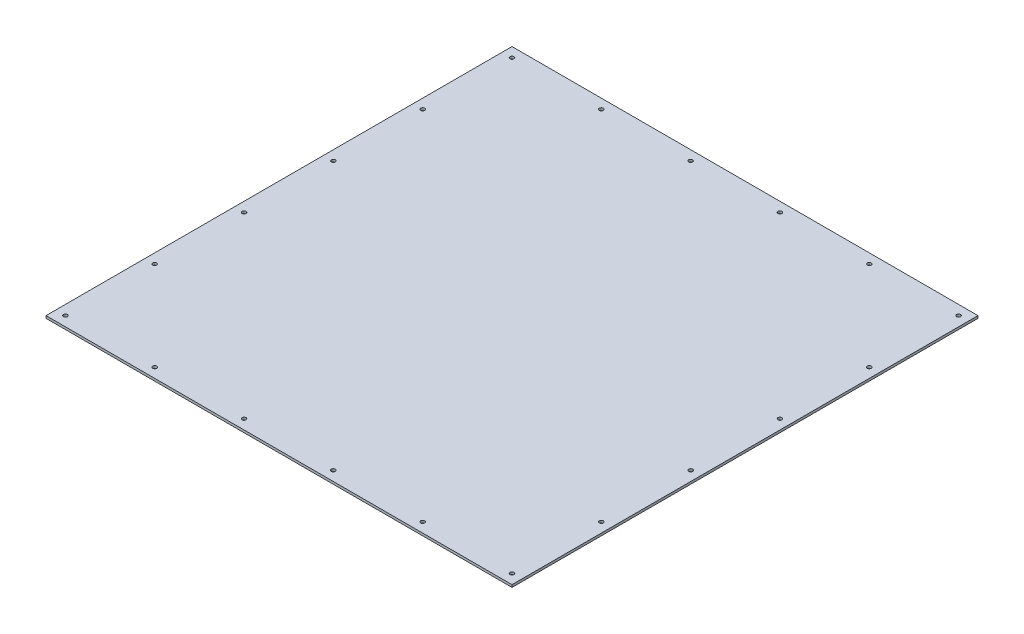
ISO-10303-21;
HEADER;
FILE_DESCRIPTION(('STEP AP214'),'2;1');
FILE_NAME('part.step','',(''),(''),'','','');
FILE_SCHEMA(('AUTOMOTIVE_DESIGN { 1 0 10303 214 1 1 1 1 }'));
ENDSEC;
DATA;
#1=APPLICATION_CONTEXT('core data for automotive mechanical design processes');
#2=APPLICATION_PROTOCOL_DEFINITION('international standard','automotive_design',2000,#1);
#3=PRODUCT_CONTEXT('',#1,'mechanical');
#4=PRODUCT('Part','Part','',(#3));
#5=PRODUCT_RELATED_PRODUCT_CATEGORY('part','',(#4));
#6=PRODUCT_DEFINITION_FORMATION('','',#4);
#7=PRODUCT_DEFINITION_CONTEXT('part definition',#1,'design');
#8=PRODUCT_DEFINITION('design','',#6,#7);
#9=PRODUCT_DEFINITION_SHAPE('','',#8);
#10=(LENGTH_UNIT() NAMED_UNIT(*) SI_UNIT(.MILLI.,.METRE.));
#11=(NAMED_UNIT(*) PLANE_ANGLE_UNIT() SI_UNIT($,.RADIAN.));
#12=(NAMED_UNIT(*) SI_UNIT($,.STERADIAN.) SOLID_ANGLE_UNIT());
#13=UNCERTAINTY_MEASURE_WITH_UNIT(LENGTH_MEASURE(1.E-05),#10,'distance_accuracy_value','');
#14=(GEOMETRIC_REPRESENTATION_CONTEXT(3) GLOBAL_UNCERTAINTY_ASSIGNED_CONTEXT((#13)) GLOBAL_UNIT_ASSIGNED_CONTEXT((#10,
#11,#12)) REPRESENTATION_CONTEXT('',''));
#15=CARTESIAN_POINT('',(0.,0.,0.));
#16=DIRECTION('',(0.,0.,1.));
#17=DIRECTION('',(1.,0.,0.));
#18=AXIS2_PLACEMENT_3D('',#15,#16,#17);
#19=CARTESIAN_POINT('',(0.,0.,0.));
#20=DIRECTION('',(0.,-1.,0.));
#21=DIRECTION('',(0.,0.,-1.));
#22=AXIS2_PLACEMENT_3D('',#19,#20,#21);
#23=PLANE('',#22);
#24=CARTESIAN_POINT('',(-292.1,0.,-292.1));
#25=DIRECTION('',(0.,1.,0.));
#26=DIRECTION('',(0.,0.,1.));
#27=AXIS2_PLACEMENT_3D('',#24,#25,#26);
#28=CIRCLE('',#27,2.5908);
#29=CARTESIAN_POINT('',(-292.1,0.,-289.5092));
#30=VERTEX_POINT('',#29);
#31=EDGE_CURVE('E284',#30,#30,#28,.T.);
#32=ORIENTED_EDGE('',*,*,#31,.T.);
#33=EDGE_LOOP('',(#32));
#34=FACE_BOUND('',#33,.T.);
#35=CARTESIAN_POINT('',(-175.26,0.,-292.1));
#36=DIRECTION('',(0.,1.,0.));
#37=DIRECTION('',(0.,0.,1.));
#38=AXIS2_PLACEMENT_3D('',#35,#36,#37);
#39=CIRCLE('',#38,2.5908);
#40=CARTESIAN_POINT('',(-175.26,0.,-289.5092));
#41=VERTEX_POINT('',#40);
#42=EDGE_CURVE('E276',#41,#41,#39,.T.);
#43=ORIENTED_EDGE('',*,*,#42,.T.);
#44=EDGE_LOOP('',(#43));
#45=FACE_BOUND('',#44,.T.);
#46=CARTESIAN_POINT('',(-58.42,0.,-292.1));
#47=DIRECTION('',(0.,1.,0.));
#48=DIRECTION('',(0.,0.,1.));
#49=AXIS2_PLACEMENT_3D('',#46,#47,#48);
#50=CIRCLE('',#49,2.5908);
#51=CARTESIAN_POINT('',(-58.42,0.,-289.5092));
#52=VERTEX_POINT('',#51);
#53=EDGE_CURVE('E268',#52,#52,#50,.T.);
#54=ORIENTED_EDGE('',*,*,#53,.T.);
#55=EDGE_LOOP('',(#54));
#56=FACE_BOUND('',#55,.T.);
#57=CARTESIAN_POINT('',(58.42,0.,-292.1));
#58=DIRECTION('',(0.,1.,0.));
#59=DIRECTION('',(0.,0.,1.));
#60=AXIS2_PLACEMENT_3D('',#57,#58,#59);
#61=CIRCLE('',#60,2.5908);
#62=CARTESIAN_POINT('',(58.42,0.,-289.5092));
#63=VERTEX_POINT('',#62);
#64=EDGE_CURVE('E260',#63,#63,#61,.T.);
#65=ORIENTED_EDGE('',*,*,#64,.T.);
#66=EDGE_LOOP('',(#65));
#67=FACE_BOUND('',#66,.T.);
#68=CARTESIAN_POINT('',(175.26,0.,-292.1));
#69=DIRECTION('',(0.,1.,0.));
#70=DIRECTION('',(0.,0.,1.));
#71=AXIS2_PLACEMENT_3D('',#68,#69,#70);
#72=CIRCLE('',#71,2.5908);
#73=CARTESIAN_POINT('',(175.26,0.,-289.5092));
#74=VERTEX_POINT('',#73);
#75=EDGE_CURVE('E252',#74,#74,#72,.T.);
#76=ORIENTED_EDGE('',*,*,#75,.T.);
#77=EDGE_LOOP('',(#76));
#78=FACE_BOUND('',#77,.T.);
#79=DIRECTION('',(0.,0.,-1.));
#80=VECTOR('',#79,1.);
#81=CARTESIAN_POINT('',(304.8,0.,304.8));
#82=LINE('',#81,#80);
#83=CARTESIAN_POINT('',(304.8,0.,304.8));
#84=VERTEX_POINT('',#83);
#85=CARTESIAN_POINT('',(304.8,0.,-304.8));
#86=VERTEX_POINT('',#85);
#87=EDGE_CURVE('E112',#84,#86,#82,.T.);
#88=ORIENTED_EDGE('',*,*,#87,.F.);
#89=DIRECTION('',(1.,0.,0.));
#90=VECTOR('',#89,1.);
#91=CARTESIAN_POINT('',(-304.8,0.,304.8));
#92=LINE('',#91,#90);
#93=CARTESIAN_POINT('',(-304.8,0.,304.8));
#94=VERTEX_POINT('',#93);
#95=EDGE_CURVE('E84',#94,#84,#92,.T.);
#96=ORIENTED_EDGE('',*,*,#95,.F.);
#97=DIRECTION('',(0.,0.,1.));
#98=VECTOR('',#97,1.);
#99=CARTESIAN_POINT('',(-304.8,0.,304.8));
#100=LINE('',#99,#98);
#101=CARTESIAN_POINT('',(-304.8,0.,-304.8));
#102=VERTEX_POINT('',#101);
#103=EDGE_CURVE('E78',#102,#94,#100,.T.);
#104=ORIENTED_EDGE('',*,*,#103,.F.);
#105=DIRECTION('',(-1.,0.,0.));
#106=VECTOR('',#105,1.);
#107=CARTESIAN_POINT('',(-304.8,0.,-304.8));
#108=LINE('',#107,#106);
#109=EDGE_CURVE('E101',#86,#102,#108,.T.);
#110=ORIENTED_EDGE('',*,*,#109,.F.);
#111=EDGE_LOOP('',(#88,#96,#104,#110));
#112=FACE_BOUND('',#111,.T.);
#113=CARTESIAN_POINT('',(292.1,0.,-292.1));
#114=DIRECTION('',(0.,1.,0.));
#115=DIRECTION('',(0.,0.,1.));
#116=AXIS2_PLACEMENT_3D('',#113,#114,#115);
#117=CIRCLE('',#116,2.5908);
#118=CARTESIAN_POINT('',(292.1,0.,-289.5092));
#119=VERTEX_POINT('',#118);
#120=EDGE_CURVE('E116',#119,#119,#117,.T.);
#121=ORIENTED_EDGE('',*,*,#120,.T.);
#122=EDGE_LOOP('',(#121));
#123=FACE_BOUND('',#122,.T.);
#124=CARTESIAN_POINT('',(292.1,0.,-175.26));
#125=DIRECTION('',(0.,1.,0.));
#126=DIRECTION('',(0.,0.,1.));
#127=AXIS2_PLACEMENT_3D('',#124,#125,#126);
#128=CIRCLE('',#127,2.5908);
#129=CARTESIAN_POINT('',(292.1,0.,-172.6692));
#130=VERTEX_POINT('',#129);
#131=EDGE_CURVE('E140',#130,#130,#128,.T.);
#132=ORIENTED_EDGE('',*,*,#131,.T.);
#133=EDGE_LOOP('',(#132));
#134=FACE_BOUND('',#133,.T.);
#135=CARTESIAN_POINT('',(292.1,0.,-58.42));
#136=DIRECTION('',(0.,1.,0.));
#137=DIRECTION('',(0.,0.,1.));
#138=AXIS2_PLACEMENT_3D('',#135,#136,#137);
#139=CIRCLE('',#138,2.5908);
#140=CARTESIAN_POINT('',(292.1,0.,-55.8292));
#141=VERTEX_POINT('',#140);
#142=EDGE_CURVE('E148',#141,#141,#139,.T.);
#143=ORIENTED_EDGE('',*,*,#142,.T.);
#144=EDGE_LOOP('',(#143));
#145=FACE_BOUND('',#144,.T.);
#146=CARTESIAN_POINT('',(292.1,0.,58.42));
#147=DIRECTION('',(0.,1.,0.));
#148=DIRECTION('',(0.,0.,1.));
#149=AXIS2_PLACEMENT_3D('',#146,#147,#148);
#150=CIRCLE('',#149,2.5908);
#151=CARTESIAN_POINT('',(292.1,0.,61.0108));
#152=VERTEX_POINT('',#151);
#153=EDGE_CURVE('E156',#152,#152,#150,.T.);
#154=ORIENTED_EDGE('',*,*,#153,.T.);
#155=EDGE_LOOP('',(#154));
#156=FACE_BOUND('',#155,.T.);
#157=CARTESIAN_POINT('',(292.1,0.,175.26));
#158=DIRECTION('',(0.,1.,0.));
#159=DIRECTION('',(0.,0.,1.));
#160=AXIS2_PLACEMENT_3D('',#157,#158,#159);
#161=CIRCLE('',#160,2.5908);
#162=CARTESIAN_POINT('',(292.1,0.,177.8508));
#163=VERTEX_POINT('',#162);
#164=EDGE_CURVE('E164',#163,#163,#161,.T.);
#165=ORIENTED_EDGE('',*,*,#164,.T.);
#166=EDGE_LOOP('',(#165));
#167=FACE_BOUND('',#166,.T.);
#168=CARTESIAN_POINT('',(292.1,0.,292.1));
#169=DIRECTION('',(0.,1.,0.));
#170=DIRECTION('',(0.,0.,1.));
#171=AXIS2_PLACEMENT_3D('',#168,#169,#170);
#172=CIRCLE('',#171,2.5908);
#173=CARTESIAN_POINT('',(292.1,0.,294.6908));
#174=VERTEX_POINT('',#173);
#175=EDGE_CURVE('E172',#174,#174,#172,.T.);
#176=ORIENTED_EDGE('',*,*,#175,.T.);
#177=EDGE_LOOP('',(#176));
#178=FACE_BOUND('',#177,.T.);
#179=CARTESIAN_POINT('',(-292.1,0.,292.1));
#180=DIRECTION('',(0.,1.,0.));
#181=DIRECTION('',(0.,0.,1.));
#182=AXIS2_PLACEMENT_3D('',#179,#180,#181);
#183=CIRCLE('',#182,2.5908);
#184=CARTESIAN_POINT('',(-292.1,0.,294.6908));
#185=VERTEX_POINT('',#184);
#186=EDGE_CURVE('E180',#185,#185,#183,.T.);
#187=ORIENTED_EDGE('',*,*,#186,.T.);
#188=EDGE_LOOP('',(#187));
#189=FACE_BOUND('',#188,.T.);
#190=CARTESIAN_POINT('',(-175.26,0.,292.1));
#191=DIRECTION('',(0.,1.,0.));
#192=DIRECTION('',(0.,0.,1.));
#193=AXIS2_PLACEMENT_3D('',#190,#191,#192);
#194=CIRCLE('',#193,2.5908);
#195=CARTESIAN_POINT('',(-175.26,0.,294.6908));
#196=VERTEX_POINT('',#195);
#197=EDGE_CURVE('E188',#196,#196,#194,.T.);
#198=ORIENTED_EDGE('',*,*,#197,.T.);
#199=EDGE_LOOP('',(#198));
#200=FACE_BOUND('',#199,.T.);
#201=CARTESIAN_POINT('',(-58.42,0.,292.1));
#202=DIRECTION('',(0.,1.,0.));
#203=DIRECTION('',(0.,0.,1.));
#204=AXIS2_PLACEMENT_3D('',#201,#202,#203);
#205=CIRCLE('',#204,2.5908);
#206=CARTESIAN_POINT('',(-58.42,0.,294.6908));
#207=VERTEX_POINT('',#206);
#208=EDGE_CURVE('E196',#207,#207,#205,.T.);
#209=ORIENTED_EDGE('',*,*,#208,.T.);
#210=EDGE_LOOP('',(#209));
#211=FACE_BOUND('',#210,.T.);
#212=CARTESIAN_POINT('',(58.42,0.,292.1));
#213=DIRECTION('',(0.,1.,0.));
#214=DIRECTION('',(0.,0.,1.));
#215=AXIS2_PLACEMENT_3D('',#212,#213,#214);
#216=CIRCLE('',#215,2.5908);
#217=CARTESIAN_POINT('',(58.42,0.,294.6908));
#218=VERTEX_POINT('',#217);
#219=EDGE_CURVE('E204',#218,#218,#216,.T.);
#220=ORIENTED_EDGE('',*,*,#219,.T.);
#221=EDGE_LOOP('',(#220));
#222=FACE_BOUND('',#221,.T.);
#223=CARTESIAN_POINT('',(175.26,0.,292.1));
#224=DIRECTION('',(0.,1.,0.));
#225=DIRECTION('',(0.,0.,1.));
#226=AXIS2_PLACEMENT_3D('',#223,#224,#225);
#227=CIRCLE('',#226,2.5908);
#228=CARTESIAN_POINT('',(175.26,0.,294.6908));
#229=VERTEX_POINT('',#228);
#230=EDGE_CURVE('E212',#229,#229,#227,.T.);
#231=ORIENTED_EDGE('',*,*,#230,.T.);
#232=EDGE_LOOP('',(#231));
#233=FACE_BOUND('',#232,.T.);
#234=CARTESIAN_POINT('',(-292.1,0.,175.26));
#235=DIRECTION('',(0.,1.,0.));
#236=DIRECTION('',(0.,0.,1.));
#237=AXIS2_PLACEMENT_3D('',#234,#235,#236);
#238=CIRCLE('',#237,2.5908);
#239=CARTESIAN_POINT('',(-292.1,0.,177.8508));
#240=VERTEX_POINT('',#239);
#241=EDGE_CURVE('E220',#240,#240,#238,.T.);
#242=ORIENTED_EDGE('',*,*,#241,.T.);
#243=EDGE_LOOP('',(#242));
#244=FACE_BOUND('',#243,.T.);
#245=CARTESIAN_POINT('',(-292.1,0.,58.42));
#246=DIRECTION('',(0.,1.,0.));
#247=DIRECTION('',(0.,0.,1.));
#248=AXIS2_PLACEMENT_3D('',#245,#246,#247);
#249=CIRCLE('',#248,2.5908);
#250=CARTESIAN_POINT('',(-292.1,0.,61.0108));
#251=VERTEX_POINT('',#250);
#252=EDGE_CURVE('E228',#251,#251,#249,.T.);
#253=ORIENTED_EDGE('',*,*,#252,.T.);
#254=EDGE_LOOP('',(#253));
#255=FACE_BOUND('',#254,.T.);
#256=CARTESIAN_POINT('',(-292.1,0.,-58.42));
#257=DIRECTION('',(0.,1.,0.));
#258=DIRECTION('',(0.,0.,1.));
#259=AXIS2_PLACEMENT_3D('',#256,#257,#258);
#260=CIRCLE('',#259,2.5908);
#261=CARTESIAN_POINT('',(-292.1,0.,-55.8292));
#262=VERTEX_POINT('',#261);
#263=EDGE_CURVE('E236',#262,#262,#260,.T.);
#264=ORIENTED_EDGE('',*,*,#263,.T.);
#265=EDGE_LOOP('',(#264));
#266=FACE_BOUND('',#265,.T.);
#267=CARTESIAN_POINT('',(-292.1,0.,-175.26));
#268=DIRECTION('',(0.,1.,0.));
#269=DIRECTION('',(0.,0.,1.));
#270=AXIS2_PLACEMENT_3D('',#267,#268,#269);
#271=CIRCLE('',#270,2.5908);
#272=CARTESIAN_POINT('',(-292.1,0.,-172.6692));
#273=VERTEX_POINT('',#272);
#274=EDGE_CURVE('E244',#273,#273,#271,.T.);
#275=ORIENTED_EDGE('',*,*,#274,.T.);
#276=EDGE_LOOP('',(#275));
#277=FACE_BOUND('',#276,.T.);
#278=ADVANCED_FACE('F43',(#34,#45,#56,#67,#78,#112,#123,#134,#145,#156,#167,#178,#189,#200,#211,
#222,#233,#244,#255,#266,#277),#23,.T.);
#279=CARTESIAN_POINT('',(304.8,3.175,304.8));
#280=DIRECTION('',(-1.,0.,0.));
#281=DIRECTION('',(0.,0.,1.));
#282=AXIS2_PLACEMENT_3D('',#279,#280,#281);
#283=PLANE('',#282);
#284=ORIENTED_EDGE('',*,*,#87,.T.);
#285=DIRECTION('',(0.,-1.,0.));
#286=VECTOR('',#285,1.);
#287=CARTESIAN_POINT('',(304.8,3.175,-304.8));
#288=LINE('',#287,#286);
#289=CARTESIAN_POINT('',(304.8,3.175,-304.8));
#290=VERTEX_POINT('',#289);
#291=EDGE_CURVE('E11',#290,#86,#288,.T.);
#292=ORIENTED_EDGE('',*,*,#291,.F.);
#293=DIRECTION('',(0.,0.,-1.));
#294=VECTOR('',#293,1.);
#295=CARTESIAN_POINT('',(304.8,3.175,304.8));
#296=LINE('',#295,#294);
#297=CARTESIAN_POINT('',(304.8,3.175,304.8));
#298=VERTEX_POINT('',#297);
#299=EDGE_CURVE('E96',#298,#290,#296,.T.);
#300=ORIENTED_EDGE('',*,*,#299,.F.);
#301=DIRECTION('',(0.,-1.,0.));
#302=VECTOR('',#301,1.);
#303=CARTESIAN_POINT('',(304.8,3.175,304.8));
#304=LINE('',#303,#302);
#305=EDGE_CURVE('E108',#298,#84,#304,.T.);
#306=ORIENTED_EDGE('',*,*,#305,.T.);
#307=EDGE_LOOP('',(#284,#292,#300,#306));
#308=FACE_BOUND('',#307,.T.);
#309=ADVANCED_FACE('F45',(#308),#283,.F.);
#310=CARTESIAN_POINT('',(-304.8,3.175,-304.8));
#311=DIRECTION('',(0.,0.,1.));
#312=DIRECTION('',(1.,0.,0.));
#313=AXIS2_PLACEMENT_3D('',#310,#311,#312);
#314=PLANE('',#313);
#315=ORIENTED_EDGE('',*,*,#109,.T.);
#316=DIRECTION('',(0.,-1.,0.));
#317=VECTOR('',#316,1.);
#318=CARTESIAN_POINT('',(-304.8,3.175,-304.8));
#319=LINE('',#318,#317);
#320=CARTESIAN_POINT('',(-304.8,3.175,-304.8));
#321=VERTEX_POINT('',#320);
#322=EDGE_CURVE('E53',#321,#102,#319,.T.);
#323=ORIENTED_EDGE('',*,*,#322,.F.);
#324=DIRECTION('',(-1.,0.,0.));
#325=VECTOR('',#324,1.);
#326=CARTESIAN_POINT('',(-304.8,3.175,-304.8));
#327=LINE('',#326,#325);
#328=EDGE_CURVE('E91',#290,#321,#327,.T.);
#329=ORIENTED_EDGE('',*,*,#328,.F.);
#330=ORIENTED_EDGE('',*,*,#291,.T.);
#331=EDGE_LOOP('',(#315,#323,#329,#330));
#332=FACE_BOUND('',#331,.T.);
#333=ADVANCED_FACE('F100',(#332),#314,.F.);
#334=CARTESIAN_POINT('',(-304.8,3.175,304.8));
#335=DIRECTION('',(1.,0.,0.));
#336=DIRECTION('',(0.,0.,-1.));
#337=AXIS2_PLACEMENT_3D('',#334,#335,#336);
#338=PLANE('',#337);
#339=ORIENTED_EDGE('',*,*,#103,.T.);
#340=DIRECTION('',(0.,-1.,0.));
#341=VECTOR('',#340,1.);
#342=CARTESIAN_POINT('',(-304.8,3.175,304.8));
#343=LINE('',#342,#341);
#344=CARTESIAN_POINT('',(-304.8,3.175,304.8));
#345=VERTEX_POINT('',#344);
#346=EDGE_CURVE('E103',#345,#94,#343,.T.);
#347=ORIENTED_EDGE('',*,*,#346,.F.);
#348=DIRECTION('',(0.,0.,1.));
#349=VECTOR('',#348,1.);
#350=CARTESIAN_POINT('',(-304.8,3.175,304.8));
#351=LINE('',#350,#349);
#352=EDGE_CURVE('E94',#321,#345,#351,.T.);
#353=ORIENTED_EDGE('',*,*,#352,.F.);
#354=ORIENTED_EDGE('',*,*,#322,.T.);
#355=EDGE_LOOP('',(#339,#347,#353,#354));
#356=FACE_BOUND('',#355,.T.);
#357=ADVANCED_FACE('F104',(#356),#338,.F.);
#358=CARTESIAN_POINT('',(-304.8,3.175,304.8));
#359=DIRECTION('',(0.,0.,-1.));
#360=DIRECTION('',(-1.,0.,0.));
#361=AXIS2_PLACEMENT_3D('',#358,#359,#360);
#362=PLANE('',#361);
#363=ORIENTED_EDGE('',*,*,#95,.T.);
#364=ORIENTED_EDGE('',*,*,#305,.F.);
#365=DIRECTION('',(1.,0.,0.));
#366=VECTOR('',#365,1.);
#367=CARTESIAN_POINT('',(-304.8,3.175,304.8));
#368=LINE('',#367,#366);
#369=EDGE_CURVE('E61',#345,#298,#368,.T.);
#370=ORIENTED_EDGE('',*,*,#369,.F.);
#371=ORIENTED_EDGE('',*,*,#346,.T.);
#372=EDGE_LOOP('',(#363,#364,#370,#371));
#373=FACE_BOUND('',#372,.T.);
#374=ADVANCED_FACE('F126',(#373),#362,.F.);
#375=CARTESIAN_POINT('',(0.,3.175,0.));
#376=DIRECTION('',(0.,-1.,0.));
#377=DIRECTION('',(0.,0.,-1.));
#378=AXIS2_PLACEMENT_3D('',#375,#376,#377);
#379=PLANE('',#378);
#380=CARTESIAN_POINT('',(-292.1,3.175,-292.1));
#381=DIRECTION('',(0.,1.,0.));
#382=DIRECTION('',(0.,0.,1.));
#383=AXIS2_PLACEMENT_3D('',#380,#381,#382);
#384=CIRCLE('',#383,2.5908);
#385=CARTESIAN_POINT('',(-292.1,3.175,-289.5092));
#386=VERTEX_POINT('',#385);
#387=EDGE_CURVE('E288',#386,#386,#384,.T.);
#388=ORIENTED_EDGE('',*,*,#387,.F.);
#389=EDGE_LOOP('',(#388));
#390=FACE_BOUND('',#389,.T.);
#391=CARTESIAN_POINT('',(-175.26,3.175,-292.1));
#392=DIRECTION('',(0.,1.,0.));
#393=DIRECTION('',(0.,0.,1.));
#394=AXIS2_PLACEMENT_3D('',#391,#392,#393);
#395=CIRCLE('',#394,2.5908);
#396=CARTESIAN_POINT('',(-175.26,3.175,-289.5092));
#397=VERTEX_POINT('',#396);
#398=EDGE_CURVE('E280',#397,#397,#395,.T.);
#399=ORIENTED_EDGE('',*,*,#398,.F.);
#400=EDGE_LOOP('',(#399));
#401=FACE_BOUND('',#400,.T.);
#402=CARTESIAN_POINT('',(-58.42,3.175,-292.1));
#403=DIRECTION('',(0.,1.,0.));
#404=DIRECTION('',(0.,0.,1.));
#405=AXIS2_PLACEMENT_3D('',#402,#403,#404);
#406=CIRCLE('',#405,2.5908);
#407=CARTESIAN_POINT('',(-58.42,3.175,-289.5092));
#408=VERTEX_POINT('',#407);
#409=EDGE_CURVE('E272',#408,#408,#406,.T.);
#410=ORIENTED_EDGE('',*,*,#409,.F.);
#411=EDGE_LOOP('',(#410));
#412=FACE_BOUND('',#411,.T.);
#413=CARTESIAN_POINT('',(58.42,3.175,-292.1));
#414=DIRECTION('',(0.,1.,0.));
#415=DIRECTION('',(0.,0.,1.));
#416=AXIS2_PLACEMENT_3D('',#413,#414,#415);
#417=CIRCLE('',#416,2.5908);
#418=CARTESIAN_POINT('',(58.42,3.175,-289.5092));
#419=VERTEX_POINT('',#418);
#420=EDGE_CURVE('E264',#419,#419,#417,.T.);
#421=ORIENTED_EDGE('',*,*,#420,.F.);
#422=EDGE_LOOP('',(#421));
#423=FACE_BOUND('',#422,.T.);
#424=CARTESIAN_POINT('',(175.26,3.175,-292.1));
#425=DIRECTION('',(0.,1.,0.));
#426=DIRECTION('',(0.,0.,1.));
#427=AXIS2_PLACEMENT_3D('',#424,#425,#426);
#428=CIRCLE('',#427,2.5908);
#429=CARTESIAN_POINT('',(175.26,3.175,-289.5092));
#430=VERTEX_POINT('',#429);
#431=EDGE_CURVE('E256',#430,#430,#428,.T.);
#432=ORIENTED_EDGE('',*,*,#431,.F.);
#433=EDGE_LOOP('',(#432));
#434=FACE_BOUND('',#433,.T.);
#435=CARTESIAN_POINT('',(-292.1,3.175,-175.26));
#436=DIRECTION('',(0.,1.,0.));
#437=DIRECTION('',(0.,0.,1.));
#438=AXIS2_PLACEMENT_3D('',#435,#436,#437);
#439=CIRCLE('',#438,2.5908);
#440=CARTESIAN_POINT('',(-292.1,3.175,-172.6692));
#441=VERTEX_POINT('',#440);
#442=EDGE_CURVE('E248',#441,#441,#439,.T.);
#443=ORIENTED_EDGE('',*,*,#442,.F.);
#444=EDGE_LOOP('',(#443));
#445=FACE_BOUND('',#444,.T.);
#446=CARTESIAN_POINT('',(-292.1,3.175,-58.42));
#447=DIRECTION('',(0.,1.,0.));
#448=DIRECTION('',(0.,0.,1.));
#449=AXIS2_PLACEMENT_3D('',#446,#447,#448);
#450=CIRCLE('',#449,2.5908);
#451=CARTESIAN_POINT('',(-292.1,3.175,-55.8292));
#452=VERTEX_POINT('',#451);
#453=EDGE_CURVE('E240',#452,#452,#450,.T.);
#454=ORIENTED_EDGE('',*,*,#453,.F.);
#455=EDGE_LOOP('',(#454));
#456=FACE_BOUND('',#455,.T.);
#457=CARTESIAN_POINT('',(-292.1,3.175,58.42));
#458=DIRECTION('',(0.,1.,0.));
#459=DIRECTION('',(0.,0.,1.));
#460=AXIS2_PLACEMENT_3D('',#457,#458,#459);
#461=CIRCLE('',#460,2.5908);
#462=CARTESIAN_POINT('',(-292.1,3.175,61.0108));
#463=VERTEX_POINT('',#462);
#464=EDGE_CURVE('E232',#463,#463,#461,.T.);
#465=ORIENTED_EDGE('',*,*,#464,.F.);
#466=EDGE_LOOP('',(#465));
#467=FACE_BOUND('',#466,.T.);
#468=CARTESIAN_POINT('',(-292.1,3.175,175.26));
#469=DIRECTION('',(0.,1.,0.));
#470=DIRECTION('',(0.,0.,1.));
#471=AXIS2_PLACEMENT_3D('',#468,#469,#470);
#472=CIRCLE('',#471,2.5908);
#473=CARTESIAN_POINT('',(-292.1,3.175,177.8508));
#474=VERTEX_POINT('',#473);
#475=EDGE_CURVE('E224',#474,#474,#472,.T.);
#476=ORIENTED_EDGE('',*,*,#475,.F.);
#477=EDGE_LOOP('',(#476));
#478=FACE_BOUND('',#477,.T.);
#479=CARTESIAN_POINT('',(175.26,3.175,292.1));
#480=DIRECTION('',(0.,1.,0.));
#481=DIRECTION('',(0.,0.,1.));
#482=AXIS2_PLACEMENT_3D('',#479,#480,#481);
#483=CIRCLE('',#482,2.5908);
#484=CARTESIAN_POINT('',(175.26,3.175,294.6908));
#485=VERTEX_POINT('',#484);
#486=EDGE_CURVE('E216',#485,#485,#483,.T.);
#487=ORIENTED_EDGE('',*,*,#486,.F.);
#488=EDGE_LOOP('',(#487));
#489=FACE_BOUND('',#488,.T.);
#490=CARTESIAN_POINT('',(58.42,3.175,292.1));
#491=DIRECTION('',(0.,1.,0.));
#492=DIRECTION('',(0.,0.,1.));
#493=AXIS2_PLACEMENT_3D('',#490,#491,#492);
#494=CIRCLE('',#493,2.5908);
#495=CARTESIAN_POINT('',(58.42,3.175,294.6908));
#496=VERTEX_POINT('',#495);
#497=EDGE_CURVE('E208',#496,#496,#494,.T.);
#498=ORIENTED_EDGE('',*,*,#497,.F.);
#499=EDGE_LOOP('',(#498));
#500=FACE_BOUND('',#499,.T.);
#501=CARTESIAN_POINT('',(-58.42,3.175,292.1));
#502=DIRECTION('',(0.,1.,0.));
#503=DIRECTION('',(0.,0.,1.));
#504=AXIS2_PLACEMENT_3D('',#501,#502,#503);
#505=CIRCLE('',#504,2.5908);
#506=CARTESIAN_POINT('',(-58.42,3.175,294.6908));
#507=VERTEX_POINT('',#506);
#508=EDGE_CURVE('E200',#507,#507,#505,.T.);
#509=ORIENTED_EDGE('',*,*,#508,.F.);
#510=EDGE_LOOP('',(#509));
#511=FACE_BOUND('',#510,.T.);
#512=CARTESIAN_POINT('',(-175.26,3.175,292.1));
#513=DIRECTION('',(0.,1.,0.));
#514=DIRECTION('',(0.,0.,1.));
#515=AXIS2_PLACEMENT_3D('',#512,#513,#514);
#516=CIRCLE('',#515,2.5908);
#517=CARTESIAN_POINT('',(-175.26,3.175,294.6908));
#518=VERTEX_POINT('',#517);
#519=EDGE_CURVE('E192',#518,#518,#516,.T.);
#520=ORIENTED_EDGE('',*,*,#519,.F.);
#521=EDGE_LOOP('',(#520));
#522=FACE_BOUND('',#521,.T.);
#523=CARTESIAN_POINT('',(-292.1,3.175,292.1));
#524=DIRECTION('',(0.,1.,0.));
#525=DIRECTION('',(0.,0.,1.));
#526=AXIS2_PLACEMENT_3D('',#523,#524,#525);
#527=CIRCLE('',#526,2.5908);
#528=CARTESIAN_POINT('',(-292.1,3.175,294.6908));
#529=VERTEX_POINT('',#528);
#530=EDGE_CURVE('E184',#529,#529,#527,.T.);
#531=ORIENTED_EDGE('',*,*,#530,.F.);
#532=EDGE_LOOP('',(#531));
#533=FACE_BOUND('',#532,.T.);
#534=CARTESIAN_POINT('',(292.1,3.175,292.1));
#535=DIRECTION('',(0.,1.,0.));
#536=DIRECTION('',(0.,0.,1.));
#537=AXIS2_PLACEMENT_3D('',#534,#535,#536);
#538=CIRCLE('',#537,2.5908);
#539=CARTESIAN_POINT('',(292.1,3.175,294.6908));
#540=VERTEX_POINT('',#539);
#541=EDGE_CURVE('E176',#540,#540,#538,.T.);
#542=ORIENTED_EDGE('',*,*,#541,.F.);
#543=EDGE_LOOP('',(#542));
#544=FACE_BOUND('',#543,.T.);
#545=CARTESIAN_POINT('',(292.1,3.175,175.26));
#546=DIRECTION('',(0.,1.,0.));
#547=DIRECTION('',(0.,0.,1.));
#548=AXIS2_PLACEMENT_3D('',#545,#546,#547);
#549=CIRCLE('',#548,2.5908);
#550=CARTESIAN_POINT('',(292.1,3.175,177.8508));
#551=VERTEX_POINT('',#550);
#552=EDGE_CURVE('E168',#551,#551,#549,.T.);
#553=ORIENTED_EDGE('',*,*,#552,.F.);
#554=EDGE_LOOP('',(#553));
#555=FACE_BOUND('',#554,.T.);
#556=CARTESIAN_POINT('',(292.1,3.175,58.42));
#557=DIRECTION('',(0.,1.,0.));
#558=DIRECTION('',(0.,0.,1.));
#559=AXIS2_PLACEMENT_3D('',#556,#557,#558);
#560=CIRCLE('',#559,2.5908);
#561=CARTESIAN_POINT('',(292.1,3.175,61.0108));
#562=VERTEX_POINT('',#561);
#563=EDGE_CURVE('E160',#562,#562,#560,.T.);
#564=ORIENTED_EDGE('',*,*,#563,.F.);
#565=EDGE_LOOP('',(#564));
#566=FACE_BOUND('',#565,.T.);
#567=CARTESIAN_POINT('',(292.1,3.175,-58.42));
#568=DIRECTION('',(0.,1.,0.));
#569=DIRECTION('',(0.,0.,1.));
#570=AXIS2_PLACEMENT_3D('',#567,#568,#569);
#571=CIRCLE('',#570,2.5908);
#572=CARTESIAN_POINT('',(292.1,3.175,-55.8292));
#573=VERTEX_POINT('',#572);
#574=EDGE_CURVE('E152',#573,#573,#571,.T.);
#575=ORIENTED_EDGE('',*,*,#574,.F.);
#576=EDGE_LOOP('',(#575));
#577=FACE_BOUND('',#576,.T.);
#578=CARTESIAN_POINT('',(292.1,3.175,-175.26));
#579=DIRECTION('',(0.,1.,0.));
#580=DIRECTION('',(0.,0.,1.));
#581=AXIS2_PLACEMENT_3D('',#578,#579,#580);
#582=CIRCLE('',#581,2.5908);
#583=CARTESIAN_POINT('',(292.1,3.175,-172.6692));
#584=VERTEX_POINT('',#583);
#585=EDGE_CURVE('E144',#584,#584,#582,.T.);
#586=ORIENTED_EDGE('',*,*,#585,.F.);
#587=EDGE_LOOP('',(#586));
#588=FACE_BOUND('',#587,.T.);
#589=CARTESIAN_POINT('',(292.1,3.175,-292.1));
#590=DIRECTION('',(0.,1.,0.));
#591=DIRECTION('',(0.,0.,1.));
#592=AXIS2_PLACEMENT_3D('',#589,#590,#591);
#593=CIRCLE('',#592,2.5908);
#594=CARTESIAN_POINT('',(292.1,3.175,-289.5092));
#595=VERTEX_POINT('',#594);
#596=EDGE_CURVE('E136',#595,#595,#593,.T.);
#597=ORIENTED_EDGE('',*,*,#596,.F.);
#598=EDGE_LOOP('',(#597));
#599=FACE_BOUND('',#598,.T.);
#600=ORIENTED_EDGE('',*,*,#299,.T.);
#601=ORIENTED_EDGE('',*,*,#328,.T.);
#602=ORIENTED_EDGE('',*,*,#352,.T.);
#603=ORIENTED_EDGE('',*,*,#369,.T.);
#604=EDGE_LOOP('',(#600,#601,#602,#603));
#605=FACE_BOUND('',#604,.T.);
#606=ADVANCED_FACE('F92',(#390,#401,#412,#423,#434,#445,#456,#467,#478,#489,#500,#511,#522,#533,
#544,#555,#566,#577,#588,#599,#605),#379,.F.);
#607=CARTESIAN_POINT('',(292.1,3.175,-292.1));
#608=DIRECTION('',(0.,1.,0.));
#609=DIRECTION('',(0.,0.,1.));
#610=AXIS2_PLACEMENT_3D('',#607,#608,#609);
#611=CYLINDRICAL_SURFACE('',#610,2.5908);
#612=ORIENTED_EDGE('',*,*,#120,.F.);
#613=EDGE_LOOP('',(#612));
#614=FACE_BOUND('',#613,.T.);
#615=ORIENTED_EDGE('',*,*,#596,.T.);
#616=EDGE_LOOP('',(#615));
#617=FACE_BOUND('',#616,.T.);
#618=ADVANCED_FACE('F297',(#614,#617),#611,.F.);
#619=CARTESIAN_POINT('',(292.1,3.175,-175.26));
#620=DIRECTION('',(0.,1.,0.));
#621=DIRECTION('',(0.,0.,1.));
#622=AXIS2_PLACEMENT_3D('',#619,#620,#621);
#623=CYLINDRICAL_SURFACE('',#622,2.5908);
#624=ORIENTED_EDGE('',*,*,#131,.F.);
#625=EDGE_LOOP('',(#624));
#626=FACE_BOUND('',#625,.T.);
#627=ORIENTED_EDGE('',*,*,#585,.T.);
#628=EDGE_LOOP('',(#627));
#629=FACE_BOUND('',#628,.T.);
#630=ADVANCED_FACE('F338',(#626,#629),#623,.F.);
#631=CARTESIAN_POINT('',(292.1,3.175,-58.42));
#632=DIRECTION('',(0.,1.,0.));
#633=DIRECTION('',(0.,0.,1.));
#634=AXIS2_PLACEMENT_3D('',#631,#632,#633);
#635=CYLINDRICAL_SURFACE('',#634,2.5908);
#636=ORIENTED_EDGE('',*,*,#142,.F.);
#637=EDGE_LOOP('',(#636));
#638=FACE_BOUND('',#637,.T.);
#639=ORIENTED_EDGE('',*,*,#574,.T.);
#640=EDGE_LOOP('',(#639));
#641=FACE_BOUND('',#640,.T.);
#642=ADVANCED_FACE('F344',(#638,#641),#635,.F.);
#643=CARTESIAN_POINT('',(292.1,3.175,58.42));
#644=DIRECTION('',(0.,1.,0.));
#645=DIRECTION('',(0.,0.,1.));
#646=AXIS2_PLACEMENT_3D('',#643,#644,#645);
#647=CYLINDRICAL_SURFACE('',#646,2.5908);
#648=ORIENTED_EDGE('',*,*,#153,.F.);
#649=EDGE_LOOP('',(#648));
#650=FACE_BOUND('',#649,.T.);
#651=ORIENTED_EDGE('',*,*,#563,.T.);
#652=EDGE_LOOP('',(#651));
#653=FACE_BOUND('',#652,.T.);
#654=ADVANCED_FACE('F401',(#650,#653),#647,.F.);
#655=CARTESIAN_POINT('',(292.1,3.175,175.26));
#656=DIRECTION('',(0.,1.,0.));
#657=DIRECTION('',(0.,0.,1.));
#658=AXIS2_PLACEMENT_3D('',#655,#656,#657);
#659=CYLINDRICAL_SURFACE('',#658,2.5908);
#660=ORIENTED_EDGE('',*,*,#164,.F.);
#661=EDGE_LOOP('',(#660));
#662=FACE_BOUND('',#661,.T.);
#663=ORIENTED_EDGE('',*,*,#552,.T.);
#664=EDGE_LOOP('',(#663));
#665=FACE_BOUND('',#664,.T.);
#666=ADVANCED_FACE('F412',(#662,#665),#659,.F.);
#667=CARTESIAN_POINT('',(292.1,3.175,292.1));
#668=DIRECTION('',(0.,1.,0.));
#669=DIRECTION('',(0.,0.,1.));
#670=AXIS2_PLACEMENT_3D('',#667,#668,#669);
#671=CYLINDRICAL_SURFACE('',#670,2.5908);
#672=ORIENTED_EDGE('',*,*,#175,.F.);
#673=EDGE_LOOP('',(#672));
#674=FACE_BOUND('',#673,.T.);
#675=ORIENTED_EDGE('',*,*,#541,.T.);
#676=EDGE_LOOP('',(#675));
#677=FACE_BOUND('',#676,.T.);
#678=ADVANCED_FACE('F423',(#674,#677),#671,.F.);
#679=CARTESIAN_POINT('',(-292.1,3.175,292.1));
#680=DIRECTION('',(0.,1.,0.));
#681=DIRECTION('',(0.,0.,1.));
#682=AXIS2_PLACEMENT_3D('',#679,#680,#681);
#683=CYLINDRICAL_SURFACE('',#682,2.5908);
#684=ORIENTED_EDGE('',*,*,#186,.F.);
#685=EDGE_LOOP('',(#684));
#686=FACE_BOUND('',#685,.T.);
#687=ORIENTED_EDGE('',*,*,#530,.T.);
#688=EDGE_LOOP('',(#687));
#689=FACE_BOUND('',#688,.T.);
#690=ADVANCED_FACE('F434',(#686,#689),#683,.F.);
#691=CARTESIAN_POINT('',(-175.26,3.175,292.1));
#692=DIRECTION('',(0.,1.,0.));
#693=DIRECTION('',(0.,0.,1.));
#694=AXIS2_PLACEMENT_3D('',#691,#692,#693);
#695=CYLINDRICAL_SURFACE('',#694,2.5908);
#696=ORIENTED_EDGE('',*,*,#197,.F.);
#697=EDGE_LOOP('',(#696));
#698=FACE_BOUND('',#697,.T.);
#699=ORIENTED_EDGE('',*,*,#519,.T.);
#700=EDGE_LOOP('',(#699));
#701=FACE_BOUND('',#700,.T.);
#702=ADVANCED_FACE('F445',(#698,#701),#695,.F.);
#703=CARTESIAN_POINT('',(-58.42,3.175,292.1));
#704=DIRECTION('',(0.,1.,0.));
#705=DIRECTION('',(0.,0.,1.));
#706=AXIS2_PLACEMENT_3D('',#703,#704,#705);
#707=CYLINDRICAL_SURFACE('',#706,2.5908);
#708=ORIENTED_EDGE('',*,*,#208,.F.);
#709=EDGE_LOOP('',(#708));
#710=FACE_BOUND('',#709,.T.);
#711=ORIENTED_EDGE('',*,*,#508,.T.);
#712=EDGE_LOOP('',(#711));
#713=FACE_BOUND('',#712,.T.);
#714=ADVANCED_FACE('F456',(#710,#713),#707,.F.);
#715=CARTESIAN_POINT('',(58.42,3.175,292.1));
#716=DIRECTION('',(0.,1.,0.));
#717=DIRECTION('',(0.,0.,1.));
#718=AXIS2_PLACEMENT_3D('',#715,#716,#717);
#719=CYLINDRICAL_SURFACE('',#718,2.5908);
#720=ORIENTED_EDGE('',*,*,#219,.F.);
#721=EDGE_LOOP('',(#720));
#722=FACE_BOUND('',#721,.T.);
#723=ORIENTED_EDGE('',*,*,#497,.T.);
#724=EDGE_LOOP('',(#723));
#725=FACE_BOUND('',#724,.T.);
#726=ADVANCED_FACE('F467',(#722,#725),#719,.F.);
#727=CARTESIAN_POINT('',(175.26,3.175,292.1));
#728=DIRECTION('',(0.,1.,0.));
#729=DIRECTION('',(0.,0.,1.));
#730=AXIS2_PLACEMENT_3D('',#727,#728,#729);
#731=CYLINDRICAL_SURFACE('',#730,2.5908);
#732=ORIENTED_EDGE('',*,*,#230,.F.);
#733=EDGE_LOOP('',(#732));
#734=FACE_BOUND('',#733,.T.);
#735=ORIENTED_EDGE('',*,*,#486,.T.);
#736=EDGE_LOOP('',(#735));
#737=FACE_BOUND('',#736,.T.);
#738=ADVANCED_FACE('F478',(#734,#737),#731,.F.);
#739=CARTESIAN_POINT('',(-292.1,3.175,175.26));
#740=DIRECTION('',(0.,1.,0.));
#741=DIRECTION('',(0.,0.,1.));
#742=AXIS2_PLACEMENT_3D('',#739,#740,#741);
#743=CYLINDRICAL_SURFACE('',#742,2.5908);
#744=ORIENTED_EDGE('',*,*,#241,.F.);
#745=EDGE_LOOP('',(#744));
#746=FACE_BOUND('',#745,.T.);
#747=ORIENTED_EDGE('',*,*,#475,.T.);
#748=EDGE_LOOP('',(#747));
#749=FACE_BOUND('',#748,.T.);
#750=ADVANCED_FACE('F489',(#746,#749),#743,.F.);
#751=CARTESIAN_POINT('',(-292.1,3.175,58.42));
#752=DIRECTION('',(0.,1.,0.));
#753=DIRECTION('',(0.,0.,1.));
#754=AXIS2_PLACEMENT_3D('',#751,#752,#753);
#755=CYLINDRICAL_SURFACE('',#754,2.5908);
#756=ORIENTED_EDGE('',*,*,#252,.F.);
#757=EDGE_LOOP('',(#756));
#758=FACE_BOUND('',#757,.T.);
#759=ORIENTED_EDGE('',*,*,#464,.T.);
#760=EDGE_LOOP('',(#759));
#761=FACE_BOUND('',#760,.T.);
#762=ADVANCED_FACE('F500',(#758,#761),#755,.F.);
#763=CARTESIAN_POINT('',(-292.1,3.175,-58.42));
#764=DIRECTION('',(0.,1.,0.));
#765=DIRECTION('',(0.,0.,1.));
#766=AXIS2_PLACEMENT_3D('',#763,#764,#765);
#767=CYLINDRICAL_SURFACE('',#766,2.5908);
#768=ORIENTED_EDGE('',*,*,#263,.F.);
#769=EDGE_LOOP('',(#768));
#770=FACE_BOUND('',#769,.T.);
#771=ORIENTED_EDGE('',*,*,#453,.T.);
#772=EDGE_LOOP('',(#771));
#773=FACE_BOUND('',#772,.T.);
#774=ADVANCED_FACE('F511',(#770,#773),#767,.F.);
#775=CARTESIAN_POINT('',(-292.1,3.175,-175.26));
#776=DIRECTION('',(0.,1.,0.));
#777=DIRECTION('',(0.,0.,1.));
#778=AXIS2_PLACEMENT_3D('',#775,#776,#777);
#779=CYLINDRICAL_SURFACE('',#778,2.5908);
#780=ORIENTED_EDGE('',*,*,#274,.F.);
#781=EDGE_LOOP('',(#780));
#782=FACE_BOUND('',#781,.T.);
#783=ORIENTED_EDGE('',*,*,#442,.T.);
#784=EDGE_LOOP('',(#783));
#785=FACE_BOUND('',#784,.T.);
#786=ADVANCED_FACE('F522',(#782,#785),#779,.F.);
#787=CARTESIAN_POINT('',(175.26,3.175,-292.1));
#788=DIRECTION('',(0.,1.,0.));
#789=DIRECTION('',(0.,0.,1.));
#790=AXIS2_PLACEMENT_3D('',#787,#788,#789);
#791=CYLINDRICAL_SURFACE('',#790,2.5908);
#792=ORIENTED_EDGE('',*,*,#75,.F.);
#793=EDGE_LOOP('',(#792));
#794=FACE_BOUND('',#793,.T.);
#795=ORIENTED_EDGE('',*,*,#431,.T.);
#796=EDGE_LOOP('',(#795));
#797=FACE_BOUND('',#796,.T.);
#798=ADVANCED_FACE('F533',(#794,#797),#791,.F.);
#799=CARTESIAN_POINT('',(58.42,3.175,-292.1));
#800=DIRECTION('',(0.,1.,0.));
#801=DIRECTION('',(0.,0.,1.));
#802=AXIS2_PLACEMENT_3D('',#799,#800,#801);
#803=CYLINDRICAL_SURFACE('',#802,2.5908);
#804=ORIENTED_EDGE('',*,*,#64,.F.);
#805=EDGE_LOOP('',(#804));
#806=FACE_BOUND('',#805,.T.);
#807=ORIENTED_EDGE('',*,*,#420,.T.);
#808=EDGE_LOOP('',(#807));
#809=FACE_BOUND('',#808,.T.);
#810=ADVANCED_FACE('F544',(#806,#809),#803,.F.);
#811=CARTESIAN_POINT('',(-58.42,3.175,-292.1));
#812=DIRECTION('',(0.,1.,0.));
#813=DIRECTION('',(0.,0.,1.));
#814=AXIS2_PLACEMENT_3D('',#811,#812,#813);
#815=CYLINDRICAL_SURFACE('',#814,2.5908);
#816=ORIENTED_EDGE('',*,*,#53,.F.);
#817=EDGE_LOOP('',(#816));
#818=FACE_BOUND('',#817,.T.);
#819=ORIENTED_EDGE('',*,*,#409,.T.);
#820=EDGE_LOOP('',(#819));
#821=FACE_BOUND('',#820,.T.);
#822=ADVANCED_FACE('F555',(#818,#821),#815,.F.);
#823=CARTESIAN_POINT('',(-175.26,3.175,-292.1));
#824=DIRECTION('',(0.,1.,0.));
#825=DIRECTION('',(0.,0.,1.));
#826=AXIS2_PLACEMENT_3D('',#823,#824,#825);
#827=CYLINDRICAL_SURFACE('',#826,2.5908);
#828=ORIENTED_EDGE('',*,*,#42,.F.);
#829=EDGE_LOOP('',(#828));
#830=FACE_BOUND('',#829,.T.);
#831=ORIENTED_EDGE('',*,*,#398,.T.);
#832=EDGE_LOOP('',(#831));
#833=FACE_BOUND('',#832,.T.);
#834=ADVANCED_FACE('F566',(#830,#833),#827,.F.);
#835=CARTESIAN_POINT('',(-292.1,3.175,-292.1));
#836=DIRECTION('',(0.,1.,0.));
#837=DIRECTION('',(0.,0.,1.));
#838=AXIS2_PLACEMENT_3D('',#835,#836,#837);
#839=CYLINDRICAL_SURFACE('',#838,2.5908);
#840=ORIENTED_EDGE('',*,*,#31,.F.);
#841=EDGE_LOOP('',(#840));
#842=FACE_BOUND('',#841,.T.);
#843=ORIENTED_EDGE('',*,*,#387,.T.);
#844=EDGE_LOOP('',(#843));
#845=FACE_BOUND('',#844,.T.);
#846=ADVANCED_FACE('F293',(#842,#845),#839,.F.);
#847=CLOSED_SHELL('',(#278,#309,#333,#357,#374,#606,#618,#630,#642,#654,#666,#678,#690,#702,
#714,#726,#738,#750,#762,#774,#786,#798,#810,#822,#834,#846));
#848=MANIFOLD_SOLID_BREP('B2',#847);
#849=ADVANCED_BREP_SHAPE_REPRESENTATION('',(#18,#848),#14);
#850=SHAPE_DEFINITION_REPRESENTATION(#9,#849);
ENDSEC;
END-ISO-10303-21;
